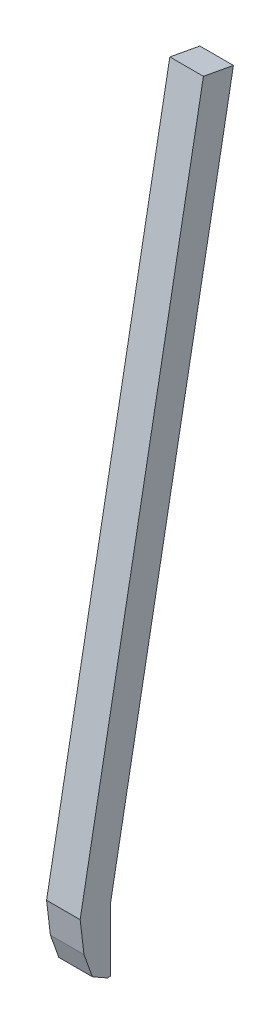
ISO-10303-21;
HEADER;
FILE_DESCRIPTION(('STEP AP214'),'2;1');
FILE_NAME('part.step','',(''),(''),'','','');
FILE_SCHEMA(('AUTOMOTIVE_DESIGN { 1 0 10303 214 1 1 1 1 }'));
ENDSEC;
DATA;
#1=APPLICATION_CONTEXT('core data for automotive mechanical design processes');
#2=APPLICATION_PROTOCOL_DEFINITION('international standard','automotive_design',2000,#1);
#3=PRODUCT_CONTEXT('',#1,'mechanical');
#4=PRODUCT('Part','Part','',(#3));
#5=PRODUCT_RELATED_PRODUCT_CATEGORY('part','',(#4));
#6=PRODUCT_DEFINITION_FORMATION('','',#4);
#7=PRODUCT_DEFINITION_CONTEXT('part definition',#1,'design');
#8=PRODUCT_DEFINITION('design','',#6,#7);
#9=PRODUCT_DEFINITION_SHAPE('','',#8);
#10=(LENGTH_UNIT() NAMED_UNIT(*) SI_UNIT(.MILLI.,.METRE.));
#11=(NAMED_UNIT(*) PLANE_ANGLE_UNIT() SI_UNIT($,.RADIAN.));
#12=(NAMED_UNIT(*) SI_UNIT($,.STERADIAN.) SOLID_ANGLE_UNIT());
#13=UNCERTAINTY_MEASURE_WITH_UNIT(LENGTH_MEASURE(1.E-05),#10,'distance_accuracy_value','');
#14=(GEOMETRIC_REPRESENTATION_CONTEXT(3) GLOBAL_UNCERTAINTY_ASSIGNED_CONTEXT((#13)) GLOBAL_UNIT_ASSIGNED_CONTEXT((#10,
#11,#12)) REPRESENTATION_CONTEXT('',''));
#15=CARTESIAN_POINT('',(0.,0.,0.));
#16=DIRECTION('',(0.,0.,1.));
#17=DIRECTION('',(1.,0.,0.));
#18=AXIS2_PLACEMENT_3D('',#15,#16,#17);
#19=CARTESIAN_POINT('',(5.5,10.5,10.));
#20=DIRECTION('',(-1.,0.,0.));
#21=DIRECTION('',(0.,-1.,0.));
#22=AXIS2_PLACEMENT_3D('',#19,#20,#21);
#23=PLANE('',#22);
#24=DIRECTION('',(0.,0.993027798842381,0.117880408576895));
#25=VECTOR('',#24,1.);
#26=CARTESIAN_POINT('',(5.5,10.5,10.));
#27=LINE('',#26,#25);
#28=CARTESIAN_POINT('',(5.5,0.,8.75356531660011));
#29=VERTEX_POINT('',#28);
#30=CARTESIAN_POINT('',(5.5,10.5,10.));
#31=VERTEX_POINT('',#30);
#32=EDGE_CURVE('E69',#29,#31,#27,.T.);
#33=ORIENTED_EDGE('',*,*,#32,.F.);
#34=DIRECTION('',(0.,0.941962933262502,0.335716893169681));
#35=VECTOR('',#34,1.);
#36=CARTESIAN_POINT('',(5.5,9.71075237672118,12.2144909041513));
#37=LINE('',#36,#35);
#38=CARTESIAN_POINT('',(5.5,-7.69347784749952,6.01159916333903));
#39=VERTEX_POINT('',#38);
#40=EDGE_CURVE('E142',#39,#29,#37,.T.);
#41=ORIENTED_EDGE('',*,*,#40,.F.);
#42=DIRECTION('',(0.,0.495114424059408,0.868827777576385));
#43=VECTOR('',#42,1.);
#44=CARTESIAN_POINT('',(5.5,-1.51787268943564,16.8485633961284));
#45=LINE('',#44,#43);
#46=CARTESIAN_POINT('',(5.5,-10.5,1.08670849971477));
#47=VERTEX_POINT('',#46);
#48=EDGE_CURVE('E134',#47,#39,#45,.T.);
#49=ORIENTED_EDGE('',*,*,#48,.F.);
#50=DIRECTION('',(0.,0.,-1.));
#51=VECTOR('',#50,1.);
#52=CARTESIAN_POINT('',(5.5,-10.5,10.));
#53=LINE('',#52,#51);
#54=CARTESIAN_POINT('',(5.5,-10.5,0.));
#55=VERTEX_POINT('',#54);
#56=EDGE_CURVE('E98',#47,#55,#53,.T.);
#57=ORIENTED_EDGE('',*,*,#56,.T.);
#58=DIRECTION('',(0.,1.,0.));
#59=VECTOR('',#58,1.);
#60=CARTESIAN_POINT('',(5.5,10.5,0.));
#61=LINE('',#60,#59);
#62=CARTESIAN_POINT('',(5.5,10.5,0.));
#63=VERTEX_POINT('',#62);
#64=EDGE_CURVE('E116',#55,#63,#61,.T.);
#65=ORIENTED_EDGE('',*,*,#64,.T.);
#66=DIRECTION('',(0.,0.983303369569063,-0.181973853600253));
#67=VECTOR('',#66,1.);
#68=CARTESIAN_POINT('',(5.5,10.5,0.));
#69=LINE('',#68,#67);
#70=CARTESIAN_POINT('',(5.5,227.697760834329,-40.1954419719833));
#71=VERTEX_POINT('',#70);
#72=EDGE_CURVE('E205',#63,#71,#69,.T.);
#73=ORIENTED_EDGE('',*,*,#72,.T.);
#74=DIRECTION('',(0.,0.181973853600254,0.983303369569063));
#75=VECTOR('',#74,1.);
#76=CARTESIAN_POINT('',(5.5,227.697760834329,-40.1954419719833));
#77=LINE('',#76,#75);
#78=CARTESIAN_POINT('',(5.5,229.517499370332,-30.3624082762927));
#79=VERTEX_POINT('',#78);
#80=EDGE_CURVE('E392',#71,#79,#77,.T.);
#81=ORIENTED_EDGE('',*,*,#80,.T.);
#82=DIRECTION('',(0.,-0.983439522214485,0.181236602667742));
#83=VECTOR('',#82,1.);
#84=CARTESIAN_POINT('',(5.5,10.5,10.));
#85=LINE('',#84,#83);
#86=EDGE_CURVE('E402',#79,#31,#85,.T.);
#87=ORIENTED_EDGE('',*,*,#86,.T.);
#88=EDGE_LOOP('',(#33,#41,#49,#57,#65,#73,#81,#87));
#89=FACE_BOUND('',#88,.T.);
#90=ADVANCED_FACE('F45',(#89),#23,.F.);
#91=CARTESIAN_POINT('',(-5.5,-10.5,10.));
#92=DIRECTION('',(1.,0.,0.));
#93=DIRECTION('',(0.,1.,0.));
#94=AXIS2_PLACEMENT_3D('',#91,#92,#93);
#95=PLANE('',#94);
#96=DIRECTION('',(0.,-0.993027798842381,-0.117880408576895));
#97=VECTOR('',#96,1.);
#98=CARTESIAN_POINT('',(-5.5,-10.2081883947486,7.54177102422916));
#99=LINE('',#98,#97);
#100=CARTESIAN_POINT('',(-5.5,10.5,10.));
#101=VERTEX_POINT('',#100);
#102=CARTESIAN_POINT('',(-5.5,0.,8.75356531660011));
#103=VERTEX_POINT('',#102);
#104=EDGE_CURVE('E424',#101,#103,#99,.T.);
#105=ORIENTED_EDGE('',*,*,#104,.F.);
#106=DIRECTION('',(0.,-0.983439522214485,0.181236602667742));
#107=VECTOR('',#106,1.);
#108=CARTESIAN_POINT('',(-5.5,10.5,10.));
#109=LINE('',#108,#107);
#110=CARTESIAN_POINT('',(-5.5,229.517499370332,-30.3624082762927));
#111=VERTEX_POINT('',#110);
#112=EDGE_CURVE('E413',#111,#101,#109,.T.);
#113=ORIENTED_EDGE('',*,*,#112,.F.);
#114=DIRECTION('',(0.,0.181973853600254,0.983303369569063));
#115=VECTOR('',#114,1.);
#116=CARTESIAN_POINT('',(-5.5,227.697760834329,-40.1954419719833));
#117=LINE('',#116,#115);
#118=CARTESIAN_POINT('',(-5.5,227.697760834329,-40.1954419719833));
#119=VERTEX_POINT('',#118);
#120=EDGE_CURVE('E393',#119,#111,#117,.T.);
#121=ORIENTED_EDGE('',*,*,#120,.F.);
#122=DIRECTION('',(0.,0.983303369569063,-0.181973853600253));
#123=VECTOR('',#122,1.);
#124=CARTESIAN_POINT('',(-5.5,10.5,0.));
#125=LINE('',#124,#123);
#126=CARTESIAN_POINT('',(-5.5,10.5,0.));
#127=VERTEX_POINT('',#126);
#128=EDGE_CURVE('E106',#127,#119,#125,.T.);
#129=ORIENTED_EDGE('',*,*,#128,.F.);
#130=DIRECTION('',(0.,-1.,0.));
#131=VECTOR('',#130,1.);
#132=CARTESIAN_POINT('',(-5.5,-10.5,0.));
#133=LINE('',#132,#131);
#134=CARTESIAN_POINT('',(-5.5,-10.5,0.));
#135=VERTEX_POINT('',#134);
#136=EDGE_CURVE('E101',#127,#135,#133,.T.);
#137=ORIENTED_EDGE('',*,*,#136,.T.);
#138=DIRECTION('',(0.,0.,-1.));
#139=VECTOR('',#138,1.);
#140=CARTESIAN_POINT('',(-5.5,-10.5,10.));
#141=LINE('',#140,#139);
#142=CARTESIAN_POINT('',(-5.5,-10.5,1.08670849971477));
#143=VERTEX_POINT('',#142);
#144=EDGE_CURVE('E86',#143,#135,#141,.T.);
#145=ORIENTED_EDGE('',*,*,#144,.F.);
#146=DIRECTION('',(0.,-0.495114424059408,-0.868827777576385));
#147=VECTOR('',#146,1.);
#148=CARTESIAN_POINT('',(-5.5,-6.6657768405809,7.8150109373959));
#149=LINE('',#148,#147);
#150=CARTESIAN_POINT('',(-5.5,-7.69347784749952,6.01159916333903));
#151=VERTEX_POINT('',#150);
#152=EDGE_CURVE('E136',#151,#143,#149,.T.);
#153=ORIENTED_EDGE('',*,*,#152,.F.);
#154=DIRECTION('',(0.,-0.941962933262502,-0.335716893169681));
#155=VECTOR('',#154,1.);
#156=CARTESIAN_POINT('',(-5.5,-8.92242514372926,5.57360064599764));
#157=LINE('',#156,#155);
#158=EDGE_CURVE('E11',#103,#151,#157,.T.);
#159=ORIENTED_EDGE('',*,*,#158,.F.);
#160=EDGE_LOOP('',(#105,#113,#121,#129,#137,#145,#153,#159));
#161=FACE_BOUND('',#160,.T.);
#162=ADVANCED_FACE('F103',(#161),#95,.F.);
#163=CARTESIAN_POINT('',(5.5,-10.5,10.));
#164=DIRECTION('',(0.,1.,0.));
#165=DIRECTION('',(0.,0.,1.));
#166=AXIS2_PLACEMENT_3D('',#163,#164,#165);
#167=PLANE('',#166);
#168=DIRECTION('',(1.,0.,0.));
#169=VECTOR('',#168,1.);
#170=CARTESIAN_POINT('',(5.5,-10.5,1.08670849971477));
#171=LINE('',#170,#169);
#172=EDGE_CURVE('E53',#143,#47,#171,.T.);
#173=ORIENTED_EDGE('',*,*,#172,.F.);
#174=ORIENTED_EDGE('',*,*,#144,.T.);
#175=DIRECTION('',(1.,0.,0.));
#176=VECTOR('',#175,1.);
#177=CARTESIAN_POINT('',(5.5,-10.5,0.));
#178=LINE('',#177,#176);
#179=EDGE_CURVE('E91',#135,#55,#178,.T.);
#180=ORIENTED_EDGE('',*,*,#179,.T.);
#181=ORIENTED_EDGE('',*,*,#56,.F.);
#182=EDGE_LOOP('',(#173,#174,#180,#181));
#183=FACE_BOUND('',#182,.T.);
#184=ADVANCED_FACE('F88',(#183),#167,.F.);
#185=CARTESIAN_POINT('',(0.,0.,0.));
#186=DIRECTION('',(0.,0.,-1.));
#187=DIRECTION('',(-1.,0.,0.));
#188=AXIS2_PLACEMENT_3D('',#185,#186,#187);
#189=PLANE('',#188);
#190=ORIENTED_EDGE('',*,*,#64,.F.);
#191=ORIENTED_EDGE('',*,*,#179,.F.);
#192=ORIENTED_EDGE('',*,*,#136,.F.);
#193=DIRECTION('',(-1.,0.,0.));
#194=VECTOR('',#193,1.);
#195=CARTESIAN_POINT('',(-5.5,10.5,0.));
#196=LINE('',#195,#194);
#197=EDGE_CURVE('E111',#63,#127,#196,.T.);
#198=ORIENTED_EDGE('',*,*,#197,.F.);
#199=EDGE_LOOP('',(#190,#191,#192,#198));
#200=FACE_BOUND('',#199,.T.);
#201=DIRECTION('',(0.,1.,0.));
#202=VECTOR('',#201,1.);
#203=CARTESIAN_POINT('',(2.,-1.5,0.));
#204=LINE('',#203,#202);
#205=CARTESIAN_POINT('',(2.,-1.5,0.));
#206=VERTEX_POINT('',#205);
#207=CARTESIAN_POINT('',(2.,1.5,0.));
#208=VERTEX_POINT('',#207);
#209=EDGE_CURVE('E157',#206,#208,#204,.T.);
#210=ORIENTED_EDGE('',*,*,#209,.T.);
#211=DIRECTION('',(-1.,0.,0.));
#212=VECTOR('',#211,1.);
#213=CARTESIAN_POINT('',(0.,1.5,0.));
#214=LINE('',#213,#212);
#215=CARTESIAN_POINT('',(-2.,1.5,0.));
#216=VERTEX_POINT('',#215);
#217=EDGE_CURVE('E147',#208,#216,#214,.T.);
#218=ORIENTED_EDGE('',*,*,#217,.T.);
#219=DIRECTION('',(0.,-1.,0.));
#220=VECTOR('',#219,1.);
#221=CARTESIAN_POINT('',(-2.,1.5,0.));
#222=LINE('',#221,#220);
#223=CARTESIAN_POINT('',(-2.,-1.5,0.));
#224=VERTEX_POINT('',#223);
#225=EDGE_CURVE('E171',#216,#224,#222,.T.);
#226=ORIENTED_EDGE('',*,*,#225,.T.);
#227=DIRECTION('',(1.,0.,0.));
#228=VECTOR('',#227,1.);
#229=CARTESIAN_POINT('',(-2.,-1.5,0.));
#230=LINE('',#229,#228);
#231=EDGE_CURVE('E175',#224,#206,#230,.T.);
#232=ORIENTED_EDGE('',*,*,#231,.T.);
#233=EDGE_LOOP('',(#210,#218,#226,#232));
#234=FACE_BOUND('',#233,.T.);
#235=ADVANCED_FACE('F113',(#200,#234),#189,.T.);
#236=CARTESIAN_POINT('',(0.,1.5,8.));
#237=DIRECTION('',(0.,-1.,0.));
#238=DIRECTION('',(1.,0.,0.));
#239=AXIS2_PLACEMENT_3D('',#236,#237,#238);
#240=PLANE('',#239);
#241=ORIENTED_EDGE('',*,*,#217,.F.);
#242=DIRECTION('',(0.,0.,-1.));
#243=VECTOR('',#242,1.);
#244=CARTESIAN_POINT('',(2.,1.5,8.));
#245=LINE('',#244,#243);
#246=CARTESIAN_POINT('',(2.,1.5,8.));
#247=VERTEX_POINT('',#246);
#248=EDGE_CURVE('E60',#247,#208,#245,.T.);
#249=ORIENTED_EDGE('',*,*,#248,.F.);
#250=DIRECTION('',(-1.,0.,0.));
#251=VECTOR('',#250,1.);
#252=CARTESIAN_POINT('',(2.,1.5,8.));
#253=LINE('',#252,#251);
#254=CARTESIAN_POINT('',(-2.,1.5,8.));
#255=VERTEX_POINT('',#254);
#256=EDGE_CURVE('E152',#247,#255,#253,.T.);
#257=ORIENTED_EDGE('',*,*,#256,.T.);
#258=DIRECTION('',(0.,0.,-1.));
#259=VECTOR('',#258,1.);
#260=CARTESIAN_POINT('',(-2.,1.5,8.));
#261=LINE('',#260,#259);
#262=EDGE_CURVE('E192',#255,#216,#261,.T.);
#263=ORIENTED_EDGE('',*,*,#262,.T.);
#264=EDGE_LOOP('',(#241,#249,#257,#263));
#265=FACE_BOUND('',#264,.T.);
#266=ADVANCED_FACE('F254',(#265),#240,.T.);
#267=CARTESIAN_POINT('',(-2.,1.5,8.));
#268=DIRECTION('',(1.,0.,0.));
#269=DIRECTION('',(0.,1.,0.));
#270=AXIS2_PLACEMENT_3D('',#267,#268,#269);
#271=PLANE('',#270);
#272=ORIENTED_EDGE('',*,*,#225,.F.);
#273=ORIENTED_EDGE('',*,*,#262,.F.);
#274=DIRECTION('',(0.,-1.,0.));
#275=VECTOR('',#274,1.);
#276=CARTESIAN_POINT('',(-2.,1.5,8.));
#277=LINE('',#276,#275);
#278=CARTESIAN_POINT('',(-2.,-1.5,8.));
#279=VERTEX_POINT('',#278);
#280=EDGE_CURVE('E156',#255,#279,#277,.T.);
#281=ORIENTED_EDGE('',*,*,#280,.T.);
#282=DIRECTION('',(0.,0.,-1.));
#283=VECTOR('',#282,1.);
#284=CARTESIAN_POINT('',(-2.,-1.5,8.));
#285=LINE('',#284,#283);
#286=EDGE_CURVE('E188',#279,#224,#285,.T.);
#287=ORIENTED_EDGE('',*,*,#286,.T.);
#288=EDGE_LOOP('',(#272,#273,#281,#287));
#289=FACE_BOUND('',#288,.T.);
#290=ADVANCED_FACE('F248',(#289),#271,.T.);
#291=CARTESIAN_POINT('',(-2.,-1.5,8.));
#292=DIRECTION('',(0.,1.,0.));
#293=DIRECTION('',(0.,0.,1.));
#294=AXIS2_PLACEMENT_3D('',#291,#292,#293);
#295=PLANE('',#294);
#296=ORIENTED_EDGE('',*,*,#231,.F.);
#297=ORIENTED_EDGE('',*,*,#286,.F.);
#298=DIRECTION('',(1.,0.,0.));
#299=VECTOR('',#298,1.);
#300=CARTESIAN_POINT('',(-2.,-1.5,8.));
#301=LINE('',#300,#299);
#302=CARTESIAN_POINT('',(2.,-1.5,8.));
#303=VERTEX_POINT('',#302);
#304=EDGE_CURVE('E161',#279,#303,#301,.T.);
#305=ORIENTED_EDGE('',*,*,#304,.T.);
#306=DIRECTION('',(0.,0.,-1.));
#307=VECTOR('',#306,1.);
#308=CARTESIAN_POINT('',(2.,-1.5,8.));
#309=LINE('',#308,#307);
#310=EDGE_CURVE('E184',#303,#206,#309,.T.);
#311=ORIENTED_EDGE('',*,*,#310,.T.);
#312=EDGE_LOOP('',(#296,#297,#305,#311));
#313=FACE_BOUND('',#312,.T.);
#314=ADVANCED_FACE('F243',(#313),#295,.T.);
#315=CARTESIAN_POINT('',(2.,-1.5,8.));
#316=DIRECTION('',(-1.,0.,0.));
#317=DIRECTION('',(0.,-1.,0.));
#318=AXIS2_PLACEMENT_3D('',#315,#316,#317);
#319=PLANE('',#318);
#320=ORIENTED_EDGE('',*,*,#209,.F.);
#321=ORIENTED_EDGE('',*,*,#310,.F.);
#322=DIRECTION('',(0.,1.,0.));
#323=VECTOR('',#322,1.);
#324=CARTESIAN_POINT('',(2.,-1.5,8.));
#325=LINE('',#324,#323);
#326=EDGE_CURVE('E165',#303,#247,#325,.T.);
#327=ORIENTED_EDGE('',*,*,#326,.T.);
#328=ORIENTED_EDGE('',*,*,#248,.T.);
#329=EDGE_LOOP('',(#320,#321,#327,#328));
#330=FACE_BOUND('',#329,.T.);
#331=ADVANCED_FACE('F246',(#330),#319,.T.);
#332=CARTESIAN_POINT('',(0.,0.,8.));
#333=DIRECTION('',(0.,0.,1.));
#334=DIRECTION('',(1.,0.,0.));
#335=AXIS2_PLACEMENT_3D('',#332,#333,#334);
#336=PLANE('',#335);
#337=ORIENTED_EDGE('',*,*,#256,.F.);
#338=ORIENTED_EDGE('',*,*,#326,.F.);
#339=ORIENTED_EDGE('',*,*,#304,.F.);
#340=ORIENTED_EDGE('',*,*,#280,.F.);
#341=EDGE_LOOP('',(#337,#338,#339,#340));
#342=FACE_BOUND('',#341,.T.);
#343=ADVANCED_FACE('F253',(#342),#336,.F.);
#344=CARTESIAN_POINT('',(8.,-7.69347784749952,6.01159916333903));
#345=DIRECTION('',(0.,-0.335716893169681,0.941962933262502));
#346=DIRECTION('',(0.,-0.941962933262502,-0.335716893169681));
#347=AXIS2_PLACEMENT_3D('',#344,#345,#346);
#348=PLANE('',#347);
#349=ORIENTED_EDGE('',*,*,#40,.T.);
#350=DIRECTION('',(-1.,0.,0.));
#351=VECTOR('',#350,1.);
#352=CARTESIAN_POINT('',(8.,0.,8.75356531660011));
#353=LINE('',#352,#351);
#354=EDGE_CURVE('E398',#29,#103,#353,.T.);
#355=ORIENTED_EDGE('',*,*,#354,.T.);
#356=ORIENTED_EDGE('',*,*,#158,.T.);
#357=DIRECTION('',(-1.,0.,0.));
#358=VECTOR('',#357,1.);
#359=CARTESIAN_POINT('',(8.,-7.69347784749952,6.01159916333903));
#360=LINE('',#359,#358);
#361=EDGE_CURVE('E421',#39,#151,#360,.T.);
#362=ORIENTED_EDGE('',*,*,#361,.F.);
#363=EDGE_LOOP('',(#349,#355,#356,#362));
#364=FACE_BOUND('',#363,.T.);
#365=ADVANCED_FACE('F283',(#364),#348,.T.);
#366=CARTESIAN_POINT('',(8.,-10.5,1.08670849971477));
#367=DIRECTION('',(0.,-0.868827777576385,0.495114424059408));
#368=DIRECTION('',(0.,-0.495114424059408,-0.868827777576385));
#369=AXIS2_PLACEMENT_3D('',#366,#367,#368);
#370=PLANE('',#369);
#371=ORIENTED_EDGE('',*,*,#48,.T.);
#372=ORIENTED_EDGE('',*,*,#361,.T.);
#373=ORIENTED_EDGE('',*,*,#152,.T.);
#374=ORIENTED_EDGE('',*,*,#172,.T.);
#375=EDGE_LOOP('',(#371,#372,#373,#374));
#376=FACE_BOUND('',#375,.T.);
#377=ADVANCED_FACE('F131',(#376),#370,.T.);
#378=CARTESIAN_POINT('',(8.,0.,8.75356531660011));
#379=DIRECTION('',(0.,-0.117880408576895,0.993027798842381));
#380=DIRECTION('',(0.,-0.993027798842381,-0.117880408576895));
#381=AXIS2_PLACEMENT_3D('',#378,#379,#380);
#382=PLANE('',#381);
#383=ORIENTED_EDGE('',*,*,#32,.T.);
#384=DIRECTION('',(-1.,0.,0.));
#385=VECTOR('',#384,1.);
#386=CARTESIAN_POINT('',(-5.5,10.5,10.));
#387=LINE('',#386,#385);
#388=EDGE_CURVE('E118',#31,#101,#387,.T.);
#389=ORIENTED_EDGE('',*,*,#388,.T.);
#390=ORIENTED_EDGE('',*,*,#104,.T.);
#391=ORIENTED_EDGE('',*,*,#354,.F.);
#392=EDGE_LOOP('',(#383,#389,#390,#391));
#393=FACE_BOUND('',#392,.T.);
#394=ADVANCED_FACE('F294',(#393),#382,.T.);
#395=CARTESIAN_POINT('',(-5.5,10.5,10.));
#396=DIRECTION('',(0.,0.181236602667742,0.983439522214485));
#397=DIRECTION('',(0.,-0.983439522214485,0.181236602667742));
#398=AXIS2_PLACEMENT_3D('',#395,#396,#397);
#399=PLANE('',#398);
#400=ORIENTED_EDGE('',*,*,#388,.F.);
#401=ORIENTED_EDGE('',*,*,#86,.F.);
#402=DIRECTION('',(1.,0.,0.));
#403=VECTOR('',#402,1.);
#404=CARTESIAN_POINT('',(-5.5,229.517499370332,-30.3624082762927));
#405=LINE('',#404,#403);
#406=EDGE_CURVE('E390',#111,#79,#405,.T.);
#407=ORIENTED_EDGE('',*,*,#406,.F.);
#408=ORIENTED_EDGE('',*,*,#112,.T.);
#409=EDGE_LOOP('',(#400,#401,#407,#408));
#410=FACE_BOUND('',#409,.T.);
#411=ADVANCED_FACE('F305',(#410),#399,.T.);
#412=CARTESIAN_POINT('',(-5.5,227.697760834329,-40.1954419719833));
#413=DIRECTION('',(0.,0.983303369569063,-0.181973853600254));
#414=DIRECTION('',(0.,0.181973853600254,0.983303369569063));
#415=AXIS2_PLACEMENT_3D('',#412,#413,#414);
#416=PLANE('',#415);
#417=ORIENTED_EDGE('',*,*,#406,.T.);
#418=ORIENTED_EDGE('',*,*,#80,.F.);
#419=DIRECTION('',(1.,0.,0.));
#420=VECTOR('',#419,1.);
#421=CARTESIAN_POINT('',(-5.5,227.697760834329,-40.1954419719833));
#422=LINE('',#421,#420);
#423=EDGE_CURVE('E399',#119,#71,#422,.T.);
#424=ORIENTED_EDGE('',*,*,#423,.F.);
#425=ORIENTED_EDGE('',*,*,#120,.T.);
#426=EDGE_LOOP('',(#417,#418,#424,#425));
#427=FACE_BOUND('',#426,.T.);
#428=ADVANCED_FACE('F323',(#427),#416,.T.);
#429=CARTESIAN_POINT('',(-5.5,10.5,0.));
#430=DIRECTION('',(0.,-0.181973853600253,-0.983303369569063));
#431=DIRECTION('',(0.,0.983303369569063,-0.181973853600253));
#432=AXIS2_PLACEMENT_3D('',#429,#430,#431);
#433=PLANE('',#432);
#434=ORIENTED_EDGE('',*,*,#423,.T.);
#435=ORIENTED_EDGE('',*,*,#72,.F.);
#436=ORIENTED_EDGE('',*,*,#197,.T.);
#437=ORIENTED_EDGE('',*,*,#128,.T.);
#438=EDGE_LOOP('',(#434,#435,#436,#437));
#439=FACE_BOUND('',#438,.T.);
#440=ADVANCED_FACE('F201',(#439),#433,.T.);
#441=CLOSED_SHELL('',(#90,#162,#184,#235,#266,#290,#314,#331,#343,#365,#377,#394,#411,#428,#440));
#442=MANIFOLD_SOLID_BREP('B2',#441);
#443=ADVANCED_BREP_SHAPE_REPRESENTATION('',(#18,#442),#14);
#444=SHAPE_DEFINITION_REPRESENTATION(#9,#443);
ENDSEC;
END-ISO-10303-21;
